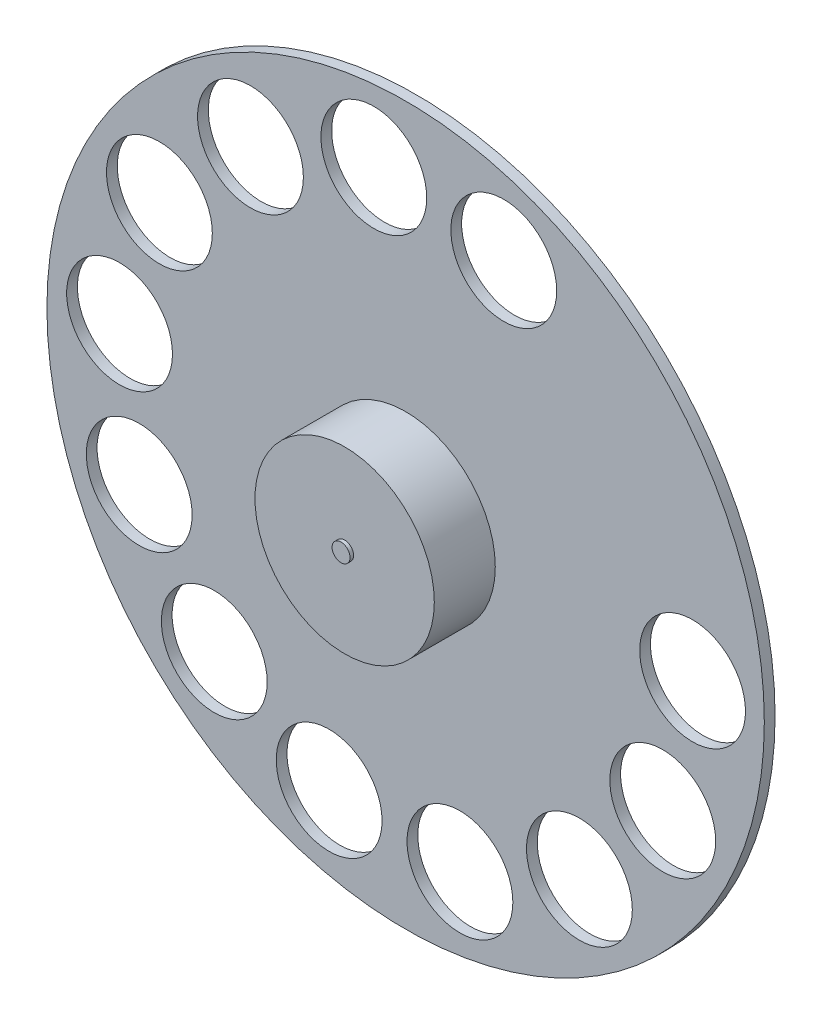
ISO-10303-21;
HEADER;
FILE_DESCRIPTION(('STEP AP214'),'2;1');
FILE_NAME('part.step','',(''),(''),'','','');
FILE_SCHEMA(('AUTOMOTIVE_DESIGN { 1 0 10303 214 1 1 1 1 }'));
ENDSEC;
DATA;
#1=APPLICATION_CONTEXT('core data for automotive mechanical design processes');
#2=APPLICATION_PROTOCOL_DEFINITION('international standard','automotive_design',2000,#1);
#3=PRODUCT_CONTEXT('',#1,'mechanical');
#4=PRODUCT('Part','Part','',(#3));
#5=PRODUCT_RELATED_PRODUCT_CATEGORY('part','',(#4));
#6=PRODUCT_DEFINITION_FORMATION('','',#4);
#7=PRODUCT_DEFINITION_CONTEXT('part definition',#1,'design');
#8=PRODUCT_DEFINITION('design','',#6,#7);
#9=PRODUCT_DEFINITION_SHAPE('','',#8);
#10=(LENGTH_UNIT() NAMED_UNIT(*) SI_UNIT(.MILLI.,.METRE.));
#11=(NAMED_UNIT(*) PLANE_ANGLE_UNIT() SI_UNIT($,.RADIAN.));
#12=(NAMED_UNIT(*) SI_UNIT($,.STERADIAN.) SOLID_ANGLE_UNIT());
#13=UNCERTAINTY_MEASURE_WITH_UNIT(LENGTH_MEASURE(1.E-05),#10,'distance_accuracy_value','');
#14=(GEOMETRIC_REPRESENTATION_CONTEXT(3) GLOBAL_UNCERTAINTY_ASSIGNED_CONTEXT((#13)) GLOBAL_UNIT_ASSIGNED_CONTEXT((#10,
#11,#12)) REPRESENTATION_CONTEXT('',''));
#15=CARTESIAN_POINT('',(0.,0.,0.));
#16=DIRECTION('',(0.,0.,1.));
#17=DIRECTION('',(1.,0.,0.));
#18=AXIS2_PLACEMENT_3D('',#15,#16,#17);
#19=CARTESIAN_POINT('',(27.3616114660543,75.1754096628724,3.));
#20=DIRECTION('',(0.,0.,-1.));
#21=DIRECTION('',(-1.,0.,0.));
#22=AXIS2_PLACEMENT_3D('',#19,#20,#21);
#23=CYLINDRICAL_SURFACE('',#22,14.75);
#24=CARTESIAN_POINT('',(27.3616114660543,75.1754096628724,3.));
#25=DIRECTION('',(0.,0.,1.));
#26=DIRECTION('',(1.,0.,0.));
#27=AXIS2_PLACEMENT_3D('',#24,#25,#26);
#28=CIRCLE('',#27,14.75);
#29=CARTESIAN_POINT('',(42.1116114660543,75.1754096628724,3.));
#30=VERTEX_POINT('',#29);
#31=EDGE_CURVE('E44',#30,#30,#28,.T.);
#32=ORIENTED_EDGE('',*,*,#31,.T.);
#33=EDGE_LOOP('',(#32));
#34=FACE_BOUND('',#33,.T.);
#35=CARTESIAN_POINT('',(27.3616114660543,75.1754096628724,0.));
#36=DIRECTION('',(0.,0.,1.));
#37=DIRECTION('',(1.,0.,0.));
#38=AXIS2_PLACEMENT_3D('',#35,#36,#37);
#39=CIRCLE('',#38,14.75);
#40=CARTESIAN_POINT('',(42.1116114660543,75.1754096628724,0.));
#41=VERTEX_POINT('',#40);
#42=EDGE_CURVE('E86',#41,#41,#39,.T.);
#43=ORIENTED_EDGE('',*,*,#42,.F.);
#44=EDGE_LOOP('',(#43));
#45=FACE_BOUND('',#44,.T.);
#46=ADVANCED_FACE('F36',(#34,#45),#23,.F.);
#47=CARTESIAN_POINT('',(80.,0.,3.));
#48=DIRECTION('',(0.,0.,-1.));
#49=DIRECTION('',(-1.,0.,0.));
#50=AXIS2_PLACEMENT_3D('',#47,#48,#49);
#51=CYLINDRICAL_SURFACE('',#50,14.75);
#52=CARTESIAN_POINT('',(80.,0.,3.));
#53=DIRECTION('',(0.,0.,1.));
#54=DIRECTION('',(1.,0.,0.));
#55=AXIS2_PLACEMENT_3D('',#52,#53,#54);
#56=CIRCLE('',#55,14.75);
#57=CARTESIAN_POINT('',(94.75,0.,3.));
#58=VERTEX_POINT('',#57);
#59=EDGE_CURVE('E128',#58,#58,#56,.T.);
#60=ORIENTED_EDGE('',*,*,#59,.T.);
#61=EDGE_LOOP('',(#60));
#62=FACE_BOUND('',#61,.T.);
#63=CARTESIAN_POINT('',(80.,0.,0.));
#64=DIRECTION('',(0.,0.,1.));
#65=DIRECTION('',(1.,0.,0.));
#66=AXIS2_PLACEMENT_3D('',#63,#64,#65);
#67=CIRCLE('',#66,14.75);
#68=CARTESIAN_POINT('',(94.75,0.,0.));
#69=VERTEX_POINT('',#68);
#70=EDGE_CURVE('E84',#69,#69,#67,.T.);
#71=ORIENTED_EDGE('',*,*,#70,.F.);
#72=EDGE_LOOP('',(#71));
#73=FACE_BOUND('',#72,.T.);
#74=ADVANCED_FACE('F147',(#62,#73),#51,.F.);
#75=CARTESIAN_POINT('',(71.6795019433068,-35.525329008462,3.));
#76=DIRECTION('',(0.,0.,-1.));
#77=DIRECTION('',(-1.,0.,0.));
#78=AXIS2_PLACEMENT_3D('',#75,#76,#77);
#79=CYLINDRICAL_SURFACE('',#78,14.75);
#80=CARTESIAN_POINT('',(71.6795019433068,-35.525329008462,3.));
#81=DIRECTION('',(0.,0.,1.));
#82=DIRECTION('',(1.,0.,0.));
#83=AXIS2_PLACEMENT_3D('',#80,#81,#82);
#84=CIRCLE('',#83,14.75);
#85=CARTESIAN_POINT('',(86.4295019433068,-35.525329008462,3.));
#86=VERTEX_POINT('',#85);
#87=EDGE_CURVE('E125',#86,#86,#84,.T.);
#88=ORIENTED_EDGE('',*,*,#87,.T.);
#89=EDGE_LOOP('',(#88));
#90=FACE_BOUND('',#89,.T.);
#91=CARTESIAN_POINT('',(71.6795019433068,-35.525329008462,0.));
#92=DIRECTION('',(0.,0.,1.));
#93=DIRECTION('',(1.,0.,0.));
#94=AXIS2_PLACEMENT_3D('',#91,#92,#93);
#95=CIRCLE('',#94,14.75);
#96=CARTESIAN_POINT('',(86.4295019433068,-35.525329008462,0.));
#97=VERTEX_POINT('',#96);
#98=EDGE_CURVE('E81',#97,#97,#95,.T.);
#99=ORIENTED_EDGE('',*,*,#98,.F.);
#100=EDGE_LOOP('',(#99));
#101=FACE_BOUND('',#100,.T.);
#102=ADVANCED_FACE('F152',(#90,#101),#79,.F.);
#103=CARTESIAN_POINT('',(48.4487749710132,-63.6609472424667,3.));
#104=DIRECTION('',(0.,0.,-1.));
#105=DIRECTION('',(-1.,0.,0.));
#106=AXIS2_PLACEMENT_3D('',#103,#104,#105);
#107=CYLINDRICAL_SURFACE('',#106,14.75);
#108=CARTESIAN_POINT('',(48.4487749710132,-63.6609472424667,3.));
#109=DIRECTION('',(0.,0.,1.));
#110=DIRECTION('',(1.,0.,0.));
#111=AXIS2_PLACEMENT_3D('',#108,#109,#110);
#112=CIRCLE('',#111,14.75);
#113=CARTESIAN_POINT('',(63.1987749710132,-63.6609472424667,3.));
#114=VERTEX_POINT('',#113);
#115=EDGE_CURVE('E122',#114,#114,#112,.T.);
#116=ORIENTED_EDGE('',*,*,#115,.T.);
#117=EDGE_LOOP('',(#116));
#118=FACE_BOUND('',#117,.T.);
#119=CARTESIAN_POINT('',(48.4487749710132,-63.6609472424667,0.));
#120=DIRECTION('',(0.,0.,1.));
#121=DIRECTION('',(1.,0.,0.));
#122=AXIS2_PLACEMENT_3D('',#119,#120,#121);
#123=CIRCLE('',#122,14.75);
#124=CARTESIAN_POINT('',(63.1987749710132,-63.6609472424667,0.));
#125=VERTEX_POINT('',#124);
#126=EDGE_CURVE('E78',#125,#125,#123,.T.);
#127=ORIENTED_EDGE('',*,*,#126,.F.);
#128=EDGE_LOOP('',(#127));
#129=FACE_BOUND('',#128,.T.);
#130=ADVANCED_FACE('F160',(#118,#129),#107,.F.);
#131=CARTESIAN_POINT('',(15.1400995488326,-78.5542957810166,3.));
#132=DIRECTION('',(0.,0.,-1.));
#133=DIRECTION('',(-1.,0.,0.));
#134=AXIS2_PLACEMENT_3D('',#131,#132,#133);
#135=CYLINDRICAL_SURFACE('',#134,14.75);
#136=CARTESIAN_POINT('',(15.1400995488326,-78.5542957810166,3.));
#137=DIRECTION('',(0.,0.,1.));
#138=DIRECTION('',(1.,0.,0.));
#139=AXIS2_PLACEMENT_3D('',#136,#137,#138);
#140=CIRCLE('',#139,14.75);
#141=CARTESIAN_POINT('',(29.8900995488326,-78.5542957810166,3.));
#142=VERTEX_POINT('',#141);
#143=EDGE_CURVE('E119',#142,#142,#140,.T.);
#144=ORIENTED_EDGE('',*,*,#143,.T.);
#145=EDGE_LOOP('',(#144));
#146=FACE_BOUND('',#145,.T.);
#147=CARTESIAN_POINT('',(15.1400995488326,-78.5542957810166,0.));
#148=DIRECTION('',(0.,0.,1.));
#149=DIRECTION('',(1.,0.,0.));
#150=AXIS2_PLACEMENT_3D('',#147,#148,#149);
#151=CIRCLE('',#150,14.75);
#152=CARTESIAN_POINT('',(29.8900995488326,-78.5542957810166,0.));
#153=VERTEX_POINT('',#152);
#154=EDGE_CURVE('E75',#153,#153,#151,.T.);
#155=ORIENTED_EDGE('',*,*,#154,.F.);
#156=EDGE_LOOP('',(#155));
#157=FACE_BOUND('',#156,.T.);
#158=ADVANCED_FACE('F164',(#146,#157),#135,.F.);
#159=CARTESIAN_POINT('',(-21.3179050952031,-77.1073726847953,3.));
#160=DIRECTION('',(0.,0.,-1.));
#161=DIRECTION('',(-1.,0.,0.));
#162=AXIS2_PLACEMENT_3D('',#159,#160,#161);
#163=CYLINDRICAL_SURFACE('',#162,14.75);
#164=CARTESIAN_POINT('',(-21.3179050952031,-77.1073726847953,3.));
#165=DIRECTION('',(0.,0.,1.));
#166=DIRECTION('',(1.,0.,0.));
#167=AXIS2_PLACEMENT_3D('',#164,#165,#166);
#168=CIRCLE('',#167,14.75);
#169=CARTESIAN_POINT('',(-6.56790509520312,-77.1073726847953,3.));
#170=VERTEX_POINT('',#169);
#171=EDGE_CURVE('E116',#170,#170,#168,.T.);
#172=ORIENTED_EDGE('',*,*,#171,.T.);
#173=EDGE_LOOP('',(#172));
#174=FACE_BOUND('',#173,.T.);
#175=CARTESIAN_POINT('',(-21.3179050952031,-77.1073726847953,0.));
#176=DIRECTION('',(0.,0.,1.));
#177=DIRECTION('',(1.,0.,0.));
#178=AXIS2_PLACEMENT_3D('',#175,#176,#177);
#179=CIRCLE('',#178,14.75);
#180=CARTESIAN_POINT('',(-6.56790509520312,-77.1073726847953,0.));
#181=VERTEX_POINT('',#180);
#182=EDGE_CURVE('E72',#181,#181,#179,.T.);
#183=ORIENTED_EDGE('',*,*,#182,.F.);
#184=EDGE_LOOP('',(#183));
#185=FACE_BOUND('',#184,.T.);
#186=ADVANCED_FACE('F168',(#174,#185),#163,.F.);
#187=CARTESIAN_POINT('',(-53.3415200413037,-59.6211559740601,3.));
#188=DIRECTION('',(0.,0.,-1.));
#189=DIRECTION('',(-1.,0.,0.));
#190=AXIS2_PLACEMENT_3D('',#187,#188,#189);
#191=CYLINDRICAL_SURFACE('',#190,14.75);
#192=CARTESIAN_POINT('',(-53.3415200413037,-59.6211559740601,3.));
#193=DIRECTION('',(0.,0.,1.));
#194=DIRECTION('',(1.,0.,0.));
#195=AXIS2_PLACEMENT_3D('',#192,#193,#194);
#196=CIRCLE('',#195,14.75);
#197=CARTESIAN_POINT('',(-38.5915200413036,-59.6211559740601,3.));
#198=VERTEX_POINT('',#197);
#199=EDGE_CURVE('E113',#198,#198,#196,.T.);
#200=ORIENTED_EDGE('',*,*,#199,.T.);
#201=EDGE_LOOP('',(#200));
#202=FACE_BOUND('',#201,.T.);
#203=CARTESIAN_POINT('',(-53.3415200413037,-59.6211559740601,0.));
#204=DIRECTION('',(0.,0.,1.));
#205=DIRECTION('',(1.,0.,0.));
#206=AXIS2_PLACEMENT_3D('',#203,#204,#205);
#207=CIRCLE('',#206,14.75);
#208=CARTESIAN_POINT('',(-38.5915200413036,-59.6211559740601,0.));
#209=VERTEX_POINT('',#208);
#210=EDGE_CURVE('E69',#209,#209,#207,.T.);
#211=ORIENTED_EDGE('',*,*,#210,.F.);
#212=EDGE_LOOP('',(#211));
#213=FACE_BOUND('',#212,.T.);
#214=ADVANCED_FACE('F172',(#202,#213),#191,.F.);
#215=CARTESIAN_POINT('',(-74.269434641286,-29.7329964528257,3.));
#216=DIRECTION('',(0.,0.,-1.));
#217=DIRECTION('',(-1.,0.,0.));
#218=AXIS2_PLACEMENT_3D('',#215,#216,#217);
#219=CYLINDRICAL_SURFACE('',#218,14.75);
#220=CARTESIAN_POINT('',(-74.269434641286,-29.7329964528257,3.));
#221=DIRECTION('',(0.,0.,1.));
#222=DIRECTION('',(1.,0.,0.));
#223=AXIS2_PLACEMENT_3D('',#220,#221,#222);
#224=CIRCLE('',#223,14.75);
#225=CARTESIAN_POINT('',(-59.519434641286,-29.7329964528257,3.));
#226=VERTEX_POINT('',#225);
#227=EDGE_CURVE('E110',#226,#226,#224,.T.);
#228=ORIENTED_EDGE('',*,*,#227,.T.);
#229=EDGE_LOOP('',(#228));
#230=FACE_BOUND('',#229,.T.);
#231=CARTESIAN_POINT('',(-74.269434641286,-29.7329964528257,0.));
#232=DIRECTION('',(0.,0.,1.));
#233=DIRECTION('',(1.,0.,0.));
#234=AXIS2_PLACEMENT_3D('',#231,#232,#233);
#235=CIRCLE('',#234,14.75);
#236=CARTESIAN_POINT('',(-59.519434641286,-29.7329964528257,0.));
#237=VERTEX_POINT('',#236);
#238=EDGE_CURVE('E66',#237,#237,#235,.T.);
#239=ORIENTED_EDGE('',*,*,#238,.F.);
#240=EDGE_LOOP('',(#239));
#241=FACE_BOUND('',#240,.T.);
#242=ADVANCED_FACE('F176',(#230,#241),#219,.F.);
#243=CARTESIAN_POINT('',(-79.7483820761554,6.33999654854365,3.));
#244=DIRECTION('',(0.,0.,-1.));
#245=DIRECTION('',(-1.,0.,0.));
#246=AXIS2_PLACEMENT_3D('',#243,#244,#245);
#247=CYLINDRICAL_SURFACE('',#246,14.75);
#248=CARTESIAN_POINT('',(-79.7483820761554,6.33999654854365,3.));
#249=DIRECTION('',(0.,0.,1.));
#250=DIRECTION('',(1.,0.,0.));
#251=AXIS2_PLACEMENT_3D('',#248,#249,#250);
#252=CIRCLE('',#251,14.75);
#253=CARTESIAN_POINT('',(-64.9983820761554,6.33999654854365,3.));
#254=VERTEX_POINT('',#253);
#255=EDGE_CURVE('E107',#254,#254,#252,.T.);
#256=ORIENTED_EDGE('',*,*,#255,.T.);
#257=EDGE_LOOP('',(#256));
#258=FACE_BOUND('',#257,.T.);
#259=CARTESIAN_POINT('',(-79.7483820761554,6.33999654854365,0.));
#260=DIRECTION('',(0.,0.,1.));
#261=DIRECTION('',(1.,0.,0.));
#262=AXIS2_PLACEMENT_3D('',#259,#260,#261);
#263=CIRCLE('',#262,14.75);
#264=CARTESIAN_POINT('',(-64.9983820761554,6.33999654854365,0.));
#265=VERTEX_POINT('',#264);
#266=EDGE_CURVE('E63',#265,#265,#263,.T.);
#267=ORIENTED_EDGE('',*,*,#266,.F.);
#268=EDGE_LOOP('',(#267));
#269=FACE_BOUND('',#268,.T.);
#270=ADVANCED_FACE('F180',(#258,#269),#247,.F.);
#271=CARTESIAN_POINT('',(-68.6386730587978,41.0941913258731,3.));
#272=DIRECTION('',(0.,0.,-1.));
#273=DIRECTION('',(-1.,0.,0.));
#274=AXIS2_PLACEMENT_3D('',#271,#272,#273);
#275=CYLINDRICAL_SURFACE('',#274,14.75);
#276=CARTESIAN_POINT('',(-68.6386730587978,41.0941913258731,3.));
#277=DIRECTION('',(0.,0.,1.));
#278=DIRECTION('',(1.,0.,0.));
#279=AXIS2_PLACEMENT_3D('',#276,#277,#278);
#280=CIRCLE('',#279,14.75);
#281=CARTESIAN_POINT('',(-53.8886730587978,41.0941913258731,3.));
#282=VERTEX_POINT('',#281);
#283=EDGE_CURVE('E100',#282,#282,#280,.T.);
#284=ORIENTED_EDGE('',*,*,#283,.T.);
#285=EDGE_LOOP('',(#284));
#286=FACE_BOUND('',#285,.T.);
#287=CARTESIAN_POINT('',(-68.6386730587978,41.0941913258731,0.));
#288=DIRECTION('',(0.,0.,1.));
#289=DIRECTION('',(1.,0.,0.));
#290=AXIS2_PLACEMENT_3D('',#287,#288,#289);
#291=CIRCLE('',#290,14.75);
#292=CARTESIAN_POINT('',(-53.8886730587978,41.0941913258731,0.));
#293=VERTEX_POINT('',#292);
#294=EDGE_CURVE('E60',#293,#293,#291,.T.);
#295=ORIENTED_EDGE('',*,*,#294,.F.);
#296=EDGE_LOOP('',(#295));
#297=FACE_BOUND('',#296,.T.);
#298=ADVANCED_FACE('F184',(#286,#297),#275,.F.);
#299=CARTESIAN_POINT('',(-43.2512653964472,67.3002826264949,3.));
#300=DIRECTION('',(0.,0.,-1.));
#301=DIRECTION('',(-1.,0.,0.));
#302=AXIS2_PLACEMENT_3D('',#299,#300,#301);
#303=CYLINDRICAL_SURFACE('',#302,14.75);
#304=CARTESIAN_POINT('',(-43.2512653964472,67.3002826264949,3.));
#305=DIRECTION('',(0.,0.,1.));
#306=DIRECTION('',(1.,0.,0.));
#307=AXIS2_PLACEMENT_3D('',#304,#305,#306);
#308=CIRCLE('',#307,14.75);
#309=CARTESIAN_POINT('',(-28.5012653964472,67.3002826264949,3.));
#310=VERTEX_POINT('',#309);
#311=EDGE_CURVE('E95',#310,#310,#308,.T.);
#312=ORIENTED_EDGE('',*,*,#311,.T.);
#313=EDGE_LOOP('',(#312));
#314=FACE_BOUND('',#313,.T.);
#315=CARTESIAN_POINT('',(-43.2512653964472,67.3002826264949,0.));
#316=DIRECTION('',(0.,0.,1.));
#317=DIRECTION('',(1.,0.,0.));
#318=AXIS2_PLACEMENT_3D('',#315,#316,#317);
#319=CIRCLE('',#318,14.75);
#320=CARTESIAN_POINT('',(-28.5012653964472,67.3002826264949,0.));
#321=VERTEX_POINT('',#320);
#322=EDGE_CURVE('E56',#321,#321,#319,.T.);
#323=ORIENTED_EDGE('',*,*,#322,.F.);
#324=EDGE_LOOP('',(#323));
#325=FACE_BOUND('',#324,.T.);
#326=ADVANCED_FACE('F187',(#314,#325),#303,.F.);
#327=CARTESIAN_POINT('',(-8.86705599208005,79.5070771569004,3.));
#328=DIRECTION('',(0.,0.,-1.));
#329=DIRECTION('',(-1.,0.,0.));
#330=AXIS2_PLACEMENT_3D('',#327,#328,#329);
#331=CYLINDRICAL_SURFACE('',#330,14.75);
#332=CARTESIAN_POINT('',(-8.86705599208005,79.5070771569004,3.));
#333=DIRECTION('',(0.,0.,1.));
#334=DIRECTION('',(1.,0.,0.));
#335=AXIS2_PLACEMENT_3D('',#332,#333,#334);
#336=CIRCLE('',#335,14.75);
#337=CARTESIAN_POINT('',(5.88294400791995,79.5070771569004,3.));
#338=VERTEX_POINT('',#337);
#339=EDGE_CURVE('E91',#338,#338,#336,.T.);
#340=ORIENTED_EDGE('',*,*,#339,.T.);
#341=EDGE_LOOP('',(#340));
#342=FACE_BOUND('',#341,.T.);
#343=CARTESIAN_POINT('',(-8.86705599208005,79.5070771569004,0.));
#344=DIRECTION('',(0.,0.,1.));
#345=DIRECTION('',(1.,0.,0.));
#346=AXIS2_PLACEMENT_3D('',#343,#344,#345);
#347=CIRCLE('',#346,14.75);
#348=CARTESIAN_POINT('',(5.88294400791995,79.5070771569004,0.));
#349=VERTEX_POINT('',#348);
#350=EDGE_CURVE('E53',#349,#349,#347,.T.);
#351=ORIENTED_EDGE('',*,*,#350,.F.);
#352=EDGE_LOOP('',(#351));
#353=FACE_BOUND('',#352,.T.);
#354=ADVANCED_FACE('F38',(#342,#353),#331,.F.);
#355=CARTESIAN_POINT('',(0.,0.,3.));
#356=DIRECTION('',(0.,0.,-1.));
#357=DIRECTION('',(-1.,0.,0.));
#358=AXIS2_PLACEMENT_3D('',#355,#356,#357);
#359=CYLINDRICAL_SURFACE('',#358,100.);
#360=CARTESIAN_POINT('',(0.,0.,3.));
#361=DIRECTION('',(0.,0.,1.));
#362=DIRECTION('',(1.,0.,0.));
#363=AXIS2_PLACEMENT_3D('',#360,#361,#362);
#364=CIRCLE('',#363,100.);
#365=CARTESIAN_POINT('',(100.,0.,3.));
#366=VERTEX_POINT('',#365);
#367=EDGE_CURVE('E10',#366,#366,#364,.T.);
#368=ORIENTED_EDGE('',*,*,#367,.F.);
#369=EDGE_LOOP('',(#368));
#370=FACE_BOUND('',#369,.T.);
#371=CARTESIAN_POINT('',(0.,0.,0.));
#372=DIRECTION('',(0.,0.,1.));
#373=DIRECTION('',(1.,0.,0.));
#374=AXIS2_PLACEMENT_3D('',#371,#372,#373);
#375=CIRCLE('',#374,100.);
#376=CARTESIAN_POINT('',(100.,0.,0.));
#377=VERTEX_POINT('',#376);
#378=EDGE_CURVE('E40',#377,#377,#375,.T.);
#379=ORIENTED_EDGE('',*,*,#378,.T.);
#380=EDGE_LOOP('',(#379));
#381=FACE_BOUND('',#380,.T.);
#382=ADVANCED_FACE('F140',(#370,#381),#359,.T.);
#383=CARTESIAN_POINT('',(0.,0.,3.));
#384=DIRECTION('',(0.,0.,1.));
#385=DIRECTION('',(1.,0.,0.));
#386=AXIS2_PLACEMENT_3D('',#383,#384,#385);
#387=PLANE('',#386);
#388=ORIENTED_EDGE('',*,*,#339,.F.);
#389=EDGE_LOOP('',(#388));
#390=FACE_BOUND('',#389,.T.);
#391=ORIENTED_EDGE('',*,*,#311,.F.);
#392=EDGE_LOOP('',(#391));
#393=FACE_BOUND('',#392,.T.);
#394=ORIENTED_EDGE('',*,*,#283,.F.);
#395=EDGE_LOOP('',(#394));
#396=FACE_BOUND('',#395,.T.);
#397=ORIENTED_EDGE('',*,*,#255,.F.);
#398=EDGE_LOOP('',(#397));
#399=FACE_BOUND('',#398,.T.);
#400=ORIENTED_EDGE('',*,*,#227,.F.);
#401=EDGE_LOOP('',(#400));
#402=FACE_BOUND('',#401,.T.);
#403=ORIENTED_EDGE('',*,*,#199,.F.);
#404=EDGE_LOOP('',(#403));
#405=FACE_BOUND('',#404,.T.);
#406=ORIENTED_EDGE('',*,*,#171,.F.);
#407=EDGE_LOOP('',(#406));
#408=FACE_BOUND('',#407,.T.);
#409=ORIENTED_EDGE('',*,*,#143,.F.);
#410=EDGE_LOOP('',(#409));
#411=FACE_BOUND('',#410,.T.);
#412=ORIENTED_EDGE('',*,*,#115,.F.);
#413=EDGE_LOOP('',(#412));
#414=FACE_BOUND('',#413,.T.);
#415=ORIENTED_EDGE('',*,*,#87,.F.);
#416=EDGE_LOOP('',(#415));
#417=FACE_BOUND('',#416,.T.);
#418=ORIENTED_EDGE('',*,*,#59,.F.);
#419=EDGE_LOOP('',(#418));
#420=FACE_BOUND('',#419,.T.);
#421=CARTESIAN_POINT('',(0.,0.,3.));
#422=DIRECTION('',(0.,0.,1.));
#423=DIRECTION('',(1.,0.,0.));
#424=AXIS2_PLACEMENT_3D('',#421,#422,#423);
#425=CIRCLE('',#424,25.);
#426=CARTESIAN_POINT('',(25.,0.,3.));
#427=VERTEX_POINT('',#426);
#428=EDGE_CURVE('E49',#427,#427,#425,.T.);
#429=ORIENTED_EDGE('',*,*,#428,.F.);
#430=EDGE_LOOP('',(#429));
#431=FACE_BOUND('',#430,.T.);
#432=ORIENTED_EDGE('',*,*,#31,.F.);
#433=EDGE_LOOP('',(#432));
#434=FACE_BOUND('',#433,.T.);
#435=ORIENTED_EDGE('',*,*,#367,.T.);
#436=EDGE_LOOP('',(#435));
#437=FACE_BOUND('',#436,.T.);
#438=ADVANCED_FACE('F136',(#390,#393,#396,#399,#402,#405,#408,#411,#414,#417,#420,#431,#434,
#437),#387,.T.);
#439=CARTESIAN_POINT('',(0.,0.,0.));
#440=DIRECTION('',(0.,0.,1.));
#441=DIRECTION('',(1.,0.,0.));
#442=AXIS2_PLACEMENT_3D('',#439,#440,#441);
#443=PLANE('',#442);
#444=ORIENTED_EDGE('',*,*,#350,.T.);
#445=EDGE_LOOP('',(#444));
#446=FACE_BOUND('',#445,.T.);
#447=ORIENTED_EDGE('',*,*,#322,.T.);
#448=EDGE_LOOP('',(#447));
#449=FACE_BOUND('',#448,.T.);
#450=ORIENTED_EDGE('',*,*,#294,.T.);
#451=EDGE_LOOP('',(#450));
#452=FACE_BOUND('',#451,.T.);
#453=ORIENTED_EDGE('',*,*,#266,.T.);
#454=EDGE_LOOP('',(#453));
#455=FACE_BOUND('',#454,.T.);
#456=ORIENTED_EDGE('',*,*,#238,.T.);
#457=EDGE_LOOP('',(#456));
#458=FACE_BOUND('',#457,.T.);
#459=ORIENTED_EDGE('',*,*,#210,.T.);
#460=EDGE_LOOP('',(#459));
#461=FACE_BOUND('',#460,.T.);
#462=ORIENTED_EDGE('',*,*,#182,.T.);
#463=EDGE_LOOP('',(#462));
#464=FACE_BOUND('',#463,.T.);
#465=ORIENTED_EDGE('',*,*,#154,.T.);
#466=EDGE_LOOP('',(#465));
#467=FACE_BOUND('',#466,.T.);
#468=ORIENTED_EDGE('',*,*,#126,.T.);
#469=EDGE_LOOP('',(#468));
#470=FACE_BOUND('',#469,.T.);
#471=ORIENTED_EDGE('',*,*,#98,.T.);
#472=EDGE_LOOP('',(#471));
#473=FACE_BOUND('',#472,.T.);
#474=ORIENTED_EDGE('',*,*,#70,.T.);
#475=EDGE_LOOP('',(#474));
#476=FACE_BOUND('',#475,.T.);
#477=ORIENTED_EDGE('',*,*,#42,.T.);
#478=EDGE_LOOP('',(#477));
#479=FACE_BOUND('',#478,.T.);
#480=ORIENTED_EDGE('',*,*,#378,.F.);
#481=EDGE_LOOP('',(#480));
#482=FACE_BOUND('',#481,.T.);
#483=ADVANCED_FACE('F139',(#446,#449,#452,#455,#458,#461,#464,#467,#470,#473,#476,#479,#482),
#443,.F.);
#484=CARTESIAN_POINT('',(0.,0.,20.));
#485=DIRECTION('',(0.,0.,-1.));
#486=DIRECTION('',(-1.,0.,0.));
#487=AXIS2_PLACEMENT_3D('',#484,#485,#486);
#488=CYLINDRICAL_SURFACE('',#487,25.);
#489=ORIENTED_EDGE('',*,*,#428,.T.);
#490=EDGE_LOOP('',(#489));
#491=FACE_BOUND('',#490,.T.);
#492=CARTESIAN_POINT('',(0.,0.,20.));
#493=DIRECTION('',(0.,0.,1.));
#494=DIRECTION('',(1.,0.,0.));
#495=AXIS2_PLACEMENT_3D('',#492,#493,#494);
#496=CIRCLE('',#495,25.);
#497=CARTESIAN_POINT('',(25.,0.,20.));
#498=VERTEX_POINT('',#497);
#499=EDGE_CURVE('E57',#498,#498,#496,.T.);
#500=ORIENTED_EDGE('',*,*,#499,.F.);
#501=EDGE_LOOP('',(#500));
#502=FACE_BOUND('',#501,.T.);
#503=ADVANCED_FACE('F133',(#491,#502),#488,.T.);
#504=CARTESIAN_POINT('',(0.,0.,20.));
#505=DIRECTION('',(0.,0.,1.));
#506=DIRECTION('',(1.,0.,0.));
#507=AXIS2_PLACEMENT_3D('',#504,#505,#506);
#508=PLANE('',#507);
#509=CARTESIAN_POINT('',(0.,0.,20.));
#510=DIRECTION('',(0.,0.,1.));
#511=DIRECTION('',(1.,0.,0.));
#512=AXIS2_PLACEMENT_3D('',#509,#510,#511);
#513=CIRCLE('',#512,2.5);
#514=CARTESIAN_POINT('',(2.5,0.,20.));
#515=VERTEX_POINT('',#514);
#516=EDGE_CURVE('E249',#515,#515,#513,.T.);
#517=ORIENTED_EDGE('',*,*,#516,.F.);
#518=EDGE_LOOP('',(#517));
#519=FACE_BOUND('',#518,.T.);
#520=ORIENTED_EDGE('',*,*,#499,.T.);
#521=EDGE_LOOP('',(#520));
#522=FACE_BOUND('',#521,.T.);
#523=ADVANCED_FACE('F231',(#519,#522),#508,.T.);
#524=CARTESIAN_POINT('',(0.,0.,21.));
#525=DIRECTION('',(0.,0.,-1.));
#526=DIRECTION('',(-1.,0.,0.));
#527=AXIS2_PLACEMENT_3D('',#524,#525,#526);
#528=CYLINDRICAL_SURFACE('',#527,2.5);
#529=CARTESIAN_POINT('',(0.,0.,21.));
#530=DIRECTION('',(0.,0.,1.));
#531=DIRECTION('',(1.,0.,0.));
#532=AXIS2_PLACEMENT_3D('',#529,#530,#531);
#533=CIRCLE('',#532,2.5);
#534=CARTESIAN_POINT('',(2.5,0.,21.));
#535=VERTEX_POINT('',#534);
#536=EDGE_CURVE('E248',#535,#535,#533,.T.);
#537=ORIENTED_EDGE('',*,*,#536,.F.);
#538=EDGE_LOOP('',(#537));
#539=FACE_BOUND('',#538,.T.);
#540=ORIENTED_EDGE('',*,*,#516,.T.);
#541=EDGE_LOOP('',(#540));
#542=FACE_BOUND('',#541,.T.);
#543=ADVANCED_FACE('F236',(#539,#542),#528,.T.);
#544=CARTESIAN_POINT('',(0.,0.,21.));
#545=DIRECTION('',(0.,0.,1.));
#546=DIRECTION('',(1.,0.,0.));
#547=AXIS2_PLACEMENT_3D('',#544,#545,#546);
#548=PLANE('',#547);
#549=ORIENTED_EDGE('',*,*,#536,.T.);
#550=EDGE_LOOP('',(#549));
#551=FACE_BOUND('',#550,.T.);
#552=ADVANCED_FACE('F240',(#551),#548,.T.);
#553=CLOSED_SHELL('',(#46,#74,#102,#130,#158,#186,#214,#242,#270,#298,#326,#354,#382,#438,#483,
#503,#523,#543,#552));
#554=MANIFOLD_SOLID_BREP('B2',#553);
#555=ADVANCED_BREP_SHAPE_REPRESENTATION('',(#18,#554),#14);
#556=SHAPE_DEFINITION_REPRESENTATION(#9,#555);
ENDSEC;
END-ISO-10303-21;
